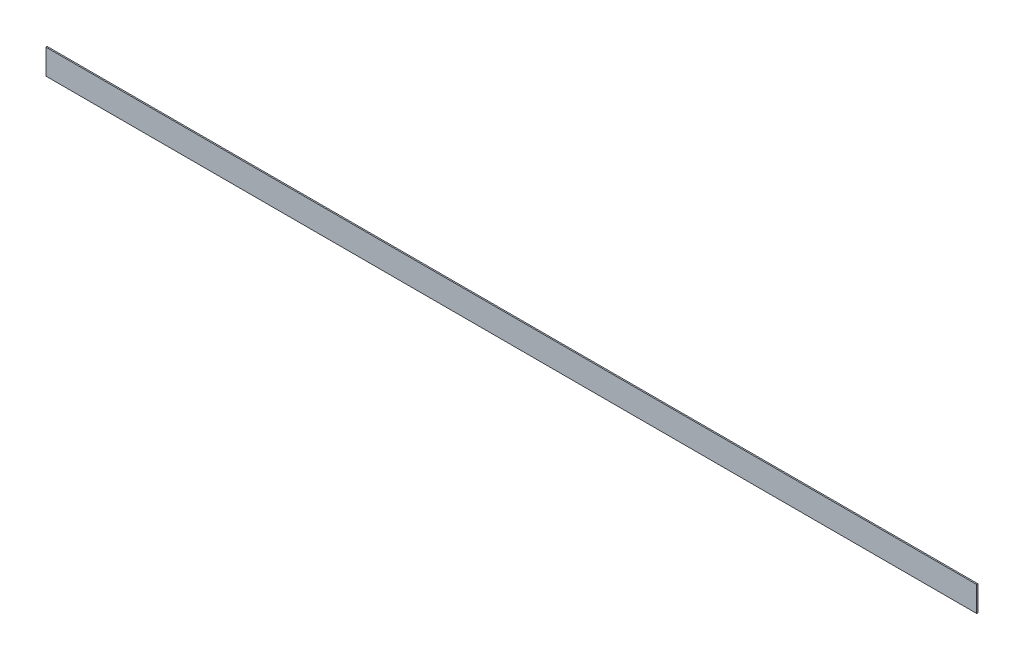
ISO-10303-21;
HEADER;
FILE_DESCRIPTION(('STEP AP214'),'2;1');
FILE_NAME('part.step','',(''),(''),'','','');
FILE_SCHEMA(('AUTOMOTIVE_DESIGN { 1 0 10303 214 1 1 1 1 }'));
ENDSEC;
DATA;
#1=APPLICATION_CONTEXT('core data for automotive mechanical design processes');
#2=APPLICATION_PROTOCOL_DEFINITION('international standard','automotive_design',2000,#1);
#3=PRODUCT_CONTEXT('',#1,'mechanical');
#4=PRODUCT('Part','Part','',(#3));
#5=PRODUCT_RELATED_PRODUCT_CATEGORY('part','',(#4));
#6=PRODUCT_DEFINITION_FORMATION('','',#4);
#7=PRODUCT_DEFINITION_CONTEXT('part definition',#1,'design');
#8=PRODUCT_DEFINITION('design','',#6,#7);
#9=PRODUCT_DEFINITION_SHAPE('','',#8);
#10=(LENGTH_UNIT() NAMED_UNIT(*) SI_UNIT(.MILLI.,.METRE.));
#11=(NAMED_UNIT(*) PLANE_ANGLE_UNIT() SI_UNIT($,.RADIAN.));
#12=(NAMED_UNIT(*) SI_UNIT($,.STERADIAN.) SOLID_ANGLE_UNIT());
#13=UNCERTAINTY_MEASURE_WITH_UNIT(LENGTH_MEASURE(1.E-05),#10,'distance_accuracy_value','');
#14=(GEOMETRIC_REPRESENTATION_CONTEXT(3) GLOBAL_UNCERTAINTY_ASSIGNED_CONTEXT((#13)) GLOBAL_UNIT_ASSIGNED_CONTEXT((#10,
#11,#12)) REPRESENTATION_CONTEXT('',''));
#15=CARTESIAN_POINT('',(0.,0.,0.));
#16=DIRECTION('',(0.,0.,1.));
#17=DIRECTION('',(1.,0.,0.));
#18=AXIS2_PLACEMENT_3D('',#15,#16,#17);
#19=CARTESIAN_POINT('',(-370.,-10.,1.));
#20=DIRECTION('',(1.,0.,0.));
#21=DIRECTION('',(0.,0.,-1.));
#22=AXIS2_PLACEMENT_3D('',#19,#20,#21);
#23=PLANE('',#22);
#24=DIRECTION('',(0.,-1.,0.));
#25=VECTOR('',#24,1.);
#26=CARTESIAN_POINT('',(-370.,-10.,0.));
#27=LINE('',#26,#25);
#28=CARTESIAN_POINT('',(-370.,9.99999999999996,0.));
#29=VERTEX_POINT('',#28);
#30=CARTESIAN_POINT('',(-370.,-10.,0.));
#31=VERTEX_POINT('',#30);
#32=EDGE_CURVE('E96',#29,#31,#27,.T.);
#33=ORIENTED_EDGE('',*,*,#32,.T.);
#34=DIRECTION('',(0.,0.,-1.));
#35=VECTOR('',#34,1.);
#36=CARTESIAN_POINT('',(-370.,-10.,1.));
#37=LINE('',#36,#35);
#38=CARTESIAN_POINT('',(-370.,-10.,1.));
#39=VERTEX_POINT('',#38);
#40=EDGE_CURVE('E11',#39,#31,#37,.T.);
#41=ORIENTED_EDGE('',*,*,#40,.F.);
#42=DIRECTION('',(0.,-1.,0.));
#43=VECTOR('',#42,1.);
#44=CARTESIAN_POINT('',(-370.,-10.,1.));
#45=LINE('',#44,#43);
#46=CARTESIAN_POINT('',(-370.,9.99999999999996,1.));
#47=VERTEX_POINT('',#46);
#48=EDGE_CURVE('E84',#47,#39,#45,.T.);
#49=ORIENTED_EDGE('',*,*,#48,.F.);
#50=DIRECTION('',(0.,0.,-1.));
#51=VECTOR('',#50,1.);
#52=CARTESIAN_POINT('',(-370.,9.99999999999996,1.));
#53=LINE('',#52,#51);
#54=EDGE_CURVE('E92',#47,#29,#53,.T.);
#55=ORIENTED_EDGE('',*,*,#54,.T.);
#56=EDGE_LOOP('',(#33,#41,#49,#55));
#57=FACE_BOUND('',#56,.T.);
#58=ADVANCED_FACE('F33',(#57),#23,.F.);
#59=CARTESIAN_POINT('',(370.,-9.99999999999996,1.));
#60=DIRECTION('',(0.,1.,0.));
#61=DIRECTION('',(-1.,0.,0.));
#62=AXIS2_PLACEMENT_3D('',#59,#60,#61);
#63=PLANE('',#62);
#64=DIRECTION('',(1.,0.,0.));
#65=VECTOR('',#64,1.);
#66=CARTESIAN_POINT('',(370.,-9.99999999999996,0.));
#67=LINE('',#66,#65);
#68=CARTESIAN_POINT('',(370.,-9.99999999999996,0.));
#69=VERTEX_POINT('',#68);
#70=EDGE_CURVE('E88',#31,#69,#67,.T.);
#71=ORIENTED_EDGE('',*,*,#70,.T.);
#72=DIRECTION('',(0.,0.,-1.));
#73=VECTOR('',#72,1.);
#74=CARTESIAN_POINT('',(370.,-9.99999999999996,1.));
#75=LINE('',#74,#73);
#76=CARTESIAN_POINT('',(370.,-9.99999999999996,1.));
#77=VERTEX_POINT('',#76);
#78=EDGE_CURVE('E41',#77,#69,#75,.T.);
#79=ORIENTED_EDGE('',*,*,#78,.F.);
#80=DIRECTION('',(1.,0.,0.));
#81=VECTOR('',#80,1.);
#82=CARTESIAN_POINT('',(370.,-9.99999999999996,1.));
#83=LINE('',#82,#81);
#84=EDGE_CURVE('E79',#39,#77,#83,.T.);
#85=ORIENTED_EDGE('',*,*,#84,.F.);
#86=ORIENTED_EDGE('',*,*,#40,.T.);
#87=EDGE_LOOP('',(#71,#79,#85,#86));
#88=FACE_BOUND('',#87,.T.);
#89=ADVANCED_FACE('F87',(#88),#63,.F.);
#90=CARTESIAN_POINT('',(370.,-9.99999999999996,1.));
#91=DIRECTION('',(-1.,0.,0.));
#92=DIRECTION('',(0.,0.,1.));
#93=AXIS2_PLACEMENT_3D('',#90,#91,#92);
#94=PLANE('',#93);
#95=DIRECTION('',(0.,1.,0.));
#96=VECTOR('',#95,1.);
#97=CARTESIAN_POINT('',(370.,-9.99999999999996,0.));
#98=LINE('',#97,#96);
#99=CARTESIAN_POINT('',(370.,10.,0.));
#100=VERTEX_POINT('',#99);
#101=EDGE_CURVE('E66',#69,#100,#98,.T.);
#102=ORIENTED_EDGE('',*,*,#101,.T.);
#103=DIRECTION('',(0.,0.,-1.));
#104=VECTOR('',#103,1.);
#105=CARTESIAN_POINT('',(370.,10.,1.));
#106=LINE('',#105,#104);
#107=CARTESIAN_POINT('',(370.,10.,1.));
#108=VERTEX_POINT('',#107);
#109=EDGE_CURVE('E89',#108,#100,#106,.T.);
#110=ORIENTED_EDGE('',*,*,#109,.F.);
#111=DIRECTION('',(0.,1.,0.));
#112=VECTOR('',#111,1.);
#113=CARTESIAN_POINT('',(370.,-9.99999999999996,1.));
#114=LINE('',#113,#112);
#115=EDGE_CURVE('E82',#77,#108,#114,.T.);
#116=ORIENTED_EDGE('',*,*,#115,.F.);
#117=ORIENTED_EDGE('',*,*,#78,.T.);
#118=EDGE_LOOP('',(#102,#110,#116,#117));
#119=FACE_BOUND('',#118,.T.);
#120=ADVANCED_FACE('F90',(#119),#94,.F.);
#121=CARTESIAN_POINT('',(370.,10.,1.));
#122=DIRECTION('',(0.,-1.,0.));
#123=DIRECTION('',(1.,0.,0.));
#124=AXIS2_PLACEMENT_3D('',#121,#122,#123);
#125=PLANE('',#124);
#126=DIRECTION('',(-1.,0.,0.));
#127=VECTOR('',#126,1.);
#128=CARTESIAN_POINT('',(370.,10.,0.));
#129=LINE('',#128,#127);
#130=EDGE_CURVE('E72',#100,#29,#129,.T.);
#131=ORIENTED_EDGE('',*,*,#130,.T.);
#132=ORIENTED_EDGE('',*,*,#54,.F.);
#133=DIRECTION('',(-1.,0.,0.));
#134=VECTOR('',#133,1.);
#135=CARTESIAN_POINT('',(370.,10.,1.));
#136=LINE('',#135,#134);
#137=EDGE_CURVE('E49',#108,#47,#136,.T.);
#138=ORIENTED_EDGE('',*,*,#137,.F.);
#139=ORIENTED_EDGE('',*,*,#109,.T.);
#140=EDGE_LOOP('',(#131,#132,#138,#139));
#141=FACE_BOUND('',#140,.T.);
#142=ADVANCED_FACE('F103',(#141),#125,.F.);
#143=CARTESIAN_POINT('',(0.,0.,1.));
#144=DIRECTION('',(0.,0.,1.));
#145=DIRECTION('',(1.,0.,0.));
#146=AXIS2_PLACEMENT_3D('',#143,#144,#145);
#147=PLANE('',#146);
#148=ORIENTED_EDGE('',*,*,#48,.T.);
#149=ORIENTED_EDGE('',*,*,#84,.T.);
#150=ORIENTED_EDGE('',*,*,#115,.T.);
#151=ORIENTED_EDGE('',*,*,#137,.T.);
#152=EDGE_LOOP('',(#148,#149,#150,#151));
#153=FACE_BOUND('',#152,.T.);
#154=ADVANCED_FACE('F80',(#153),#147,.T.);
#155=CARTESIAN_POINT('',(0.,0.,0.));
#156=DIRECTION('',(0.,0.,1.));
#157=DIRECTION('',(1.,0.,0.));
#158=AXIS2_PLACEMENT_3D('',#155,#156,#157);
#159=PLANE('',#158);
#160=ORIENTED_EDGE('',*,*,#32,.F.);
#161=ORIENTED_EDGE('',*,*,#130,.F.);
#162=ORIENTED_EDGE('',*,*,#101,.F.);
#163=ORIENTED_EDGE('',*,*,#70,.F.);
#164=EDGE_LOOP('',(#160,#161,#162,#163));
#165=FACE_BOUND('',#164,.T.);
#166=ADVANCED_FACE('F106',(#165),#159,.F.);
#167=CLOSED_SHELL('',(#58,#89,#120,#142,#154,#166));
#168=MANIFOLD_SOLID_BREP('B2',#167);
#169=ADVANCED_BREP_SHAPE_REPRESENTATION('',(#18,#168),#14);
#170=SHAPE_DEFINITION_REPRESENTATION(#9,#169);
ENDSEC;
END-ISO-10303-21;
